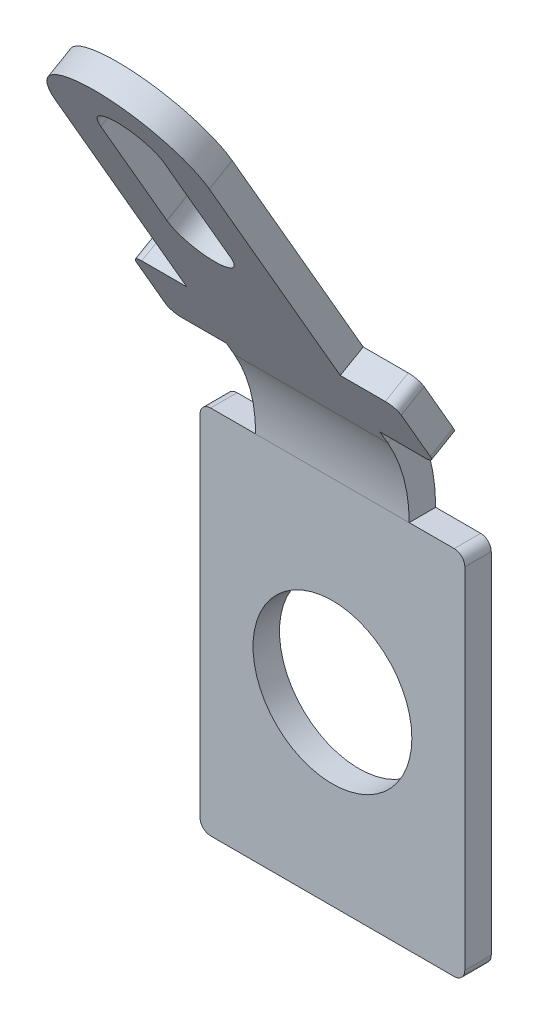
ISO-10303-21;
HEADER;
FILE_DESCRIPTION(('STEP AP214'),'2;1');
FILE_NAME('part.step','',(''),(''),'','','');
FILE_SCHEMA(('AUTOMOTIVE_DESIGN { 1 0 10303 214 1 1 1 1 }'));
ENDSEC;
DATA;
#1=APPLICATION_CONTEXT('core data for automotive mechanical design processes');
#2=APPLICATION_PROTOCOL_DEFINITION('international standard','automotive_design',2000,#1);
#3=PRODUCT_CONTEXT('',#1,'mechanical');
#4=PRODUCT('Part','Part','',(#3));
#5=PRODUCT_RELATED_PRODUCT_CATEGORY('part','',(#4));
#6=PRODUCT_DEFINITION_FORMATION('','',#4);
#7=PRODUCT_DEFINITION_CONTEXT('part definition',#1,'design');
#8=PRODUCT_DEFINITION('design','',#6,#7);
#9=PRODUCT_DEFINITION_SHAPE('','',#8);
#10=(LENGTH_UNIT() NAMED_UNIT(*) SI_UNIT(.MILLI.,.METRE.));
#11=(NAMED_UNIT(*) PLANE_ANGLE_UNIT() SI_UNIT($,.RADIAN.));
#12=(NAMED_UNIT(*) SI_UNIT($,.STERADIAN.) SOLID_ANGLE_UNIT());
#13=UNCERTAINTY_MEASURE_WITH_UNIT(LENGTH_MEASURE(1.E-05),#10,'distance_accuracy_value','');
#14=(GEOMETRIC_REPRESENTATION_CONTEXT(3) GLOBAL_UNCERTAINTY_ASSIGNED_CONTEXT((#13)) GLOBAL_UNIT_ASSIGNED_CONTEXT((#10,
#11,#12)) REPRESENTATION_CONTEXT('',''));
#15=CARTESIAN_POINT('',(0.,0.,0.));
#16=DIRECTION('',(0.,0.,1.));
#17=DIRECTION('',(1.,0.,0.));
#18=AXIS2_PLACEMENT_3D('',#15,#16,#17);
#19=CARTESIAN_POINT('',(-2.5,12.3480762113533,4.06698729810775));
#20=DIRECTION('',(1.,0.,0.));
#21=DIRECTION('',(0.,1.,0.));
#22=AXIS2_PLACEMENT_3D('',#19,#20,#21);
#23=PLANE('',#22);
#24=DIRECTION('',(0.,0.866025403784442,0.499999999999995));
#25=VECTOR('',#24,1.);
#26=CARTESIAN_POINT('',(-2.5,1.92884757729333,-1.94855715851496));
#27=LINE('',#26,#25);
#28=CARTESIAN_POINT('',(-2.5,5.68154390488543,0.218063076407229));
#29=VERTEX_POINT('',#28);
#30=CARTESIAN_POINT('',(-2.5,6.63417184904832,0.768063076407222));
#31=VERTEX_POINT('',#30);
#32=EDGE_CURVE('E389',#29,#31,#27,.T.);
#33=ORIENTED_EDGE('',*,*,#32,.F.);
#34=DIRECTION('',(0.,-0.500000000000001,0.866025403784438));
#35=VECTOR('',#34,1.);
#36=CARTESIAN_POINT('',(-2.5,5.68154390488546,0.218063076407183));
#37=LINE('',#36,#35);
#38=CARTESIAN_POINT('',(-2.5,5.43154390488543,0.651075778299447));
#39=VERTEX_POINT('',#38);
#40=EDGE_CURVE('E412',#29,#39,#37,.T.);
#41=ORIENTED_EDGE('',*,*,#40,.T.);
#42=DIRECTION('',(0.,-0.866025403784442,-0.499999999999995));
#43=VECTOR('',#42,1.);
#44=CARTESIAN_POINT('',(-2.5,12.0980762113533,4.49999999999997));
#45=LINE('',#44,#43);
#46=CARTESIAN_POINT('',(-2.5,6.38417184904832,1.20107577829944));
#47=VERTEX_POINT('',#46);
#48=EDGE_CURVE('E372',#39,#47,#45,.F.);
#49=ORIENTED_EDGE('',*,*,#48,.T.);
#50=DIRECTION('',(0.,-0.500000000000001,0.866025403784438));
#51=VECTOR('',#50,1.);
#52=CARTESIAN_POINT('',(-2.5,6.63417184904834,0.768063076407184));
#53=LINE('',#52,#51);
#54=EDGE_CURVE('E406',#47,#31,#53,.F.);
#55=ORIENTED_EDGE('',*,*,#54,.T.);
#56=EDGE_LOOP('',(#33,#41,#49,#55));
#57=FACE_BOUND('',#56,.T.);
#58=ADVANCED_FACE('F59',(#57),#23,.F.);
#59=CARTESIAN_POINT('',(2.5,4.55384757729334,-0.433012701892206));
#60=DIRECTION('',(-1.,0.,0.));
#61=DIRECTION('',(0.,0.,1.));
#62=AXIS2_PLACEMENT_3D('',#59,#60,#61);
#63=PLANE('',#62);
#64=DIRECTION('',(0.,-0.866025403784442,-0.499999999999995));
#65=VECTOR('',#64,1.);
#66=CARTESIAN_POINT('',(2.5,1.92884757729333,-1.94855715851496));
#67=LINE('',#66,#65);
#68=CARTESIAN_POINT('',(2.5,6.63417184904832,0.768063076407223));
#69=VERTEX_POINT('',#68);
#70=CARTESIAN_POINT('',(2.5,5.68154390488543,0.218063076407229));
#71=VERTEX_POINT('',#70);
#72=EDGE_CURVE('E386',#69,#71,#67,.T.);
#73=ORIENTED_EDGE('',*,*,#72,.F.);
#74=DIRECTION('',(0.,-0.500000000000001,0.866025403784438));
#75=VECTOR('',#74,1.);
#76=CARTESIAN_POINT('',(2.5,6.63417184904831,0.768063076407238));
#77=LINE('',#76,#75);
#78=CARTESIAN_POINT('',(2.5,6.38417184904832,1.20107577829944));
#79=VERTEX_POINT('',#78);
#80=EDGE_CURVE('E438',#69,#79,#77,.T.);
#81=ORIENTED_EDGE('',*,*,#80,.T.);
#82=DIRECTION('',(0.,0.866025403784442,0.499999999999995));
#83=VECTOR('',#82,1.);
#84=CARTESIAN_POINT('',(2.5,4.30384757729335,0.));
#85=LINE('',#84,#83);
#86=CARTESIAN_POINT('',(2.5,5.43154390488543,0.651075778299448));
#87=VERTEX_POINT('',#86);
#88=EDGE_CURVE('E392',#79,#87,#85,.F.);
#89=ORIENTED_EDGE('',*,*,#88,.T.);
#90=DIRECTION('',(0.,-0.500000000000001,0.866025403784438));
#91=VECTOR('',#90,1.);
#92=CARTESIAN_POINT('',(2.5,5.68154390488543,0.218063076407236));
#93=LINE('',#92,#91);
#94=EDGE_CURVE('E436',#87,#71,#93,.F.);
#95=ORIENTED_EDGE('',*,*,#94,.T.);
#96=EDGE_LOOP('',(#73,#81,#89,#95));
#97=FACE_BOUND('',#96,.T.);
#98=ADVANCED_FACE('F557',(#97),#63,.F.);
#99=CARTESIAN_POINT('',(0.,1.92884757729333,-1.94855715851496));
#100=DIRECTION('',(0.,-0.499999999999995,0.866025403784442));
#101=DIRECTION('',(0.,-0.866025403784442,-0.499999999999995));
#102=AXIS2_PLACEMENT_3D('',#99,#100,#101);
#103=PLANE('',#102);
#104=DIRECTION('',(0.,0.866025403784438,0.500000000000001));
#105=VECTOR('',#104,1.);
#106=CARTESIAN_POINT('',(0.6,11.0923393758659,3.34198729810775));
#107=LINE('',#106,#105);
#108=CARTESIAN_POINT('',(0.6,8.92727586640479,2.09198729810775));
#109=VERTEX_POINT('',#108);
#110=CARTESIAN_POINT('',(0.6,11.0923393758659,3.34198729810775));
#111=VERTEX_POINT('',#110);
#112=EDGE_CURVE('E304',#109,#111,#107,.T.);
#113=ORIENTED_EDGE('',*,*,#112,.T.);
#114=CARTESIAN_POINT('',(0.,11.0923393758659,3.34198729810775));
#115=DIRECTION('',(0.,-0.500000000000001,0.866025403784438));
#116=DIRECTION('',(1.,0.,0.));
#117=AXIS2_PLACEMENT_3D('',#114,#115,#116);
#118=CIRCLE('',#117,0.6);
#119=CARTESIAN_POINT('',(-0.6,11.0923393758659,3.34198729810775));
#120=VERTEX_POINT('',#119);
#121=EDGE_CURVE('E294',#111,#120,#118,.T.);
#122=ORIENTED_EDGE('',*,*,#121,.T.);
#123=DIRECTION('',(0.,-0.866025403784438,-0.500000000000001));
#124=VECTOR('',#123,1.);
#125=CARTESIAN_POINT('',(-0.6,11.0923393758659,3.34198729810775));
#126=LINE('',#125,#124);
#127=CARTESIAN_POINT('',(-0.6,8.92727586640478,2.09198729810777));
#128=VERTEX_POINT('',#127);
#129=EDGE_CURVE('E297',#120,#128,#126,.T.);
#130=ORIENTED_EDGE('',*,*,#129,.T.);
#131=CARTESIAN_POINT('',(0.,8.92727586640479,2.09198729810775));
#132=DIRECTION('',(0.,-0.500000000000001,0.866025403784438));
#133=DIRECTION('',(1.,0.,0.));
#134=AXIS2_PLACEMENT_3D('',#131,#132,#133);
#135=CIRCLE('',#134,0.6);
#136=EDGE_CURVE('E301',#128,#109,#135,.T.);
#137=ORIENTED_EDGE('',*,*,#136,.T.);
#138=EDGE_LOOP('',(#113,#122,#130,#137));
#139=FACE_BOUND('',#138,.T.);
#140=DIRECTION('',(-1.,0.,0.));
#141=VECTOR('',#140,1.);
#142=CARTESIAN_POINT('',(-1.45,5.50833882412857,0.118063076407182));
#143=LINE('',#142,#141);
#144=CARTESIAN_POINT('',(-1.45,5.50833882412857,0.118063076407182));
#145=VERTEX_POINT('',#144);
#146=CARTESIAN_POINT('',(-2.3,5.50833882412857,0.118063076407182));
#147=VERTEX_POINT('',#146);
#148=EDGE_CURVE('E328',#145,#147,#143,.T.);
#149=ORIENTED_EDGE('',*,*,#148,.T.);
#150=CARTESIAN_POINT('',(-2.3,5.68154390488543,0.218063076407229));
#151=DIRECTION('',(0.,-0.499999999999995,0.866025403784442));
#152=DIRECTION('',(0.,-0.866025403784442,-0.499999999999995));
#153=AXIS2_PLACEMENT_3D('',#150,#151,#152);
#154=CIRCLE('',#153,0.2);
#155=EDGE_CURVE('E431',#147,#29,#154,.F.);
#156=ORIENTED_EDGE('',*,*,#155,.T.);
#157=ORIENTED_EDGE('',*,*,#32,.T.);
#158=CARTESIAN_POINT('',(-2.3,6.63417184904832,0.768063076407223));
#159=DIRECTION('',(0.,-0.499999999999995,0.866025403784442));
#160=DIRECTION('',(0.,-0.866025403784442,-0.499999999999995));
#161=AXIS2_PLACEMENT_3D('',#158,#159,#160);
#162=CIRCLE('',#161,0.2);
#163=CARTESIAN_POINT('',(-2.3,6.80737692980523,0.868063076407183));
#164=VERTEX_POINT('',#163);
#165=EDGE_CURVE('E429',#31,#164,#162,.F.);
#166=ORIENTED_EDGE('',*,*,#165,.T.);
#167=DIRECTION('',(1.,0.,0.));
#168=VECTOR('',#167,1.);
#169=CARTESIAN_POINT('',(-2.5,6.80737692980523,0.868063076407183));
#170=LINE('',#169,#168);
#171=CARTESIAN_POINT('',(-1.45,6.80737692980523,0.868063076407183));
#172=VERTEX_POINT('',#171);
#173=EDGE_CURVE('E331',#164,#172,#170,.T.);
#174=ORIENTED_EDGE('',*,*,#173,.T.);
#175=DIRECTION('',(0.,0.866025403784438,0.500000000000001));
#176=VECTOR('',#175,1.);
#177=CARTESIAN_POINT('',(-1.45,6.80737692980523,0.868063076407183));
#178=LINE('',#177,#176);
#179=CARTESIAN_POINT('',(-1.45,11.0923393758659,3.34198729810775));
#180=VERTEX_POINT('',#179);
#181=EDGE_CURVE('E334',#172,#180,#178,.T.);
#182=ORIENTED_EDGE('',*,*,#181,.T.);
#183=CARTESIAN_POINT('',(0.,11.0923393758659,3.34198729810775));
#184=DIRECTION('',(0.,0.500000000000001,-0.866025403784438));
#185=DIRECTION('',(-1.,0.,0.));
#186=AXIS2_PLACEMENT_3D('',#183,#184,#185);
#187=CIRCLE('',#186,1.45);
#188=CARTESIAN_POINT('',(1.45,11.0923393758659,3.34198729810775));
#189=VERTEX_POINT('',#188);
#190=EDGE_CURVE('E337',#180,#189,#187,.T.);
#191=ORIENTED_EDGE('',*,*,#190,.T.);
#192=DIRECTION('',(0.,-0.866025403784438,-0.500000000000001));
#193=VECTOR('',#192,1.);
#194=CARTESIAN_POINT('',(1.45,11.0923393758659,3.34198729810775));
#195=LINE('',#194,#193);
#196=CARTESIAN_POINT('',(1.45,6.80737692980523,0.868063076407183));
#197=VERTEX_POINT('',#196);
#198=EDGE_CURVE('E340',#189,#197,#195,.T.);
#199=ORIENTED_EDGE('',*,*,#198,.T.);
#200=DIRECTION('',(1.,0.,0.));
#201=VECTOR('',#200,1.);
#202=CARTESIAN_POINT('',(1.45,6.80737692980523,0.868063076407183));
#203=LINE('',#202,#201);
#204=CARTESIAN_POINT('',(2.3,6.80737692980523,0.868063076407183));
#205=VERTEX_POINT('',#204);
#206=EDGE_CURVE('E343',#197,#205,#203,.T.);
#207=ORIENTED_EDGE('',*,*,#206,.T.);
#208=CARTESIAN_POINT('',(2.3,6.63417184904832,0.768063076407223));
#209=DIRECTION('',(0.,-0.499999999999995,0.866025403784442));
#210=DIRECTION('',(0.,-0.866025403784442,-0.499999999999995));
#211=AXIS2_PLACEMENT_3D('',#208,#209,#210);
#212=CIRCLE('',#211,0.2);
#213=EDGE_CURVE('E427',#205,#69,#212,.F.);
#214=ORIENTED_EDGE('',*,*,#213,.T.);
#215=ORIENTED_EDGE('',*,*,#72,.T.);
#216=CARTESIAN_POINT('',(2.3,5.68154390488543,0.218063076407229));
#217=DIRECTION('',(0.,-0.499999999999995,0.866025403784442));
#218=DIRECTION('',(0.,-0.866025403784442,-0.499999999999995));
#219=AXIS2_PLACEMENT_3D('',#216,#217,#218);
#220=CIRCLE('',#219,0.2);
#221=CARTESIAN_POINT('',(2.3,5.50833882412857,0.118063076407182));
#222=VERTEX_POINT('',#221);
#223=EDGE_CURVE('E425',#71,#222,#220,.F.);
#224=ORIENTED_EDGE('',*,*,#223,.T.);
#225=DIRECTION('',(-1.,0.,0.));
#226=VECTOR('',#225,1.);
#227=CARTESIAN_POINT('',(2.5,5.50833882412857,0.118063076407182));
#228=LINE('',#227,#226);
#229=CARTESIAN_POINT('',(1.45,5.50833882412857,0.118063076407182));
#230=VERTEX_POINT('',#229);
#231=EDGE_CURVE('E346',#222,#230,#228,.T.);
#232=ORIENTED_EDGE('',*,*,#231,.T.);
#233=DIRECTION('',(0.,-0.866025403784438,-0.500000000000001));
#234=VECTOR('',#233,1.);
#235=CARTESIAN_POINT('',(1.45,5.50833882412857,0.118063076407182));
#236=LINE('',#235,#234);
#237=CARTESIAN_POINT('',(1.45,5.24999999999998,-0.0310889132455919));
#238=VERTEX_POINT('',#237);
#239=EDGE_CURVE('E348',#230,#238,#236,.T.);
#240=ORIENTED_EDGE('',*,*,#239,.T.);
#241=DIRECTION('',(1.,0.,0.));
#242=VECTOR('',#241,1.);
#243=CARTESIAN_POINT('',(2.5,5.24999999999997,-0.0310889132455307));
#244=LINE('',#243,#242);
#245=CARTESIAN_POINT('',(-1.45,5.24999999999996,-0.0310889132455606));
#246=VERTEX_POINT('',#245);
#247=EDGE_CURVE('E281',#246,#238,#244,.T.);
#248=ORIENTED_EDGE('',*,*,#247,.F.);
#249=DIRECTION('',(0.,0.866025403784438,0.500000000000001));
#250=VECTOR('',#249,1.);
#251=CARTESIAN_POINT('',(-1.45,3.7762880165597,-0.88193692359282));
#252=LINE('',#251,#250);
#253=EDGE_CURVE('E332',#246,#145,#252,.T.);
#254=ORIENTED_EDGE('',*,*,#253,.T.);
#255=EDGE_LOOP('',(#149,#156,#157,#166,#174,#182,#191,#199,#207,#214,#215,#224,#232,#240,#248,#254));
#256=FACE_BOUND('',#255,.T.);
#257=ADVANCED_FACE('F562',(#139,#256),#103,.F.);
#258=CARTESIAN_POINT('',(0.,1.67884757729333,-1.51554445662274));
#259=DIRECTION('',(0.,-0.499999999999995,0.866025403784442));
#260=DIRECTION('',(0.,-0.866025403784442,-0.499999999999995));
#261=AXIS2_PLACEMENT_3D('',#258,#259,#260);
#262=PLANE('',#261);
#263=CARTESIAN_POINT('',(0.,10.8423393758659,3.77500000000002));
#264=DIRECTION('',(0.,-0.500000000000001,0.866025403784438));
#265=DIRECTION('',(1.,0.,0.));
#266=AXIS2_PLACEMENT_3D('',#263,#264,#265);
#267=CIRCLE('',#266,0.6);
#268=CARTESIAN_POINT('',(0.6,10.8423393758659,3.77500000000002));
#269=VERTEX_POINT('',#268);
#270=CARTESIAN_POINT('',(-0.6,10.8423393758659,3.77499999999998));
#271=VERTEX_POINT('',#270);
#272=EDGE_CURVE('E308',#269,#271,#267,.T.);
#273=ORIENTED_EDGE('',*,*,#272,.F.);
#274=DIRECTION('',(0.,0.866025403784438,0.500000000000001));
#275=VECTOR('',#274,1.);
#276=CARTESIAN_POINT('',(0.6,10.8423393758659,3.77500000000002));
#277=LINE('',#276,#275);
#278=CARTESIAN_POINT('',(0.6,8.67727586640476,2.52500000000002));
#279=VERTEX_POINT('',#278);
#280=EDGE_CURVE('E298',#279,#269,#277,.T.);
#281=ORIENTED_EDGE('',*,*,#280,.F.);
#282=CARTESIAN_POINT('',(0.,8.67727586640476,2.52500000000002));
#283=DIRECTION('',(0.,-0.500000000000001,0.866025403784438));
#284=DIRECTION('',(1.,0.,0.));
#285=AXIS2_PLACEMENT_3D('',#282,#283,#284);
#286=CIRCLE('',#285,0.6);
#287=CARTESIAN_POINT('',(-0.6,8.67727586640476,2.52500000000002));
#288=VERTEX_POINT('',#287);
#289=EDGE_CURVE('E314',#288,#279,#286,.T.);
#290=ORIENTED_EDGE('',*,*,#289,.F.);
#291=DIRECTION('',(0.,-0.866025403784438,-0.500000000000001));
#292=VECTOR('',#291,1.);
#293=CARTESIAN_POINT('',(-0.6,10.8423393758659,3.77500000000002));
#294=LINE('',#293,#292);
#295=EDGE_CURVE('E310',#271,#288,#294,.T.);
#296=ORIENTED_EDGE('',*,*,#295,.F.);
#297=EDGE_LOOP('',(#273,#281,#290,#296));
#298=FACE_BOUND('',#297,.T.);
#299=ORIENTED_EDGE('',*,*,#48,.F.);
#300=CARTESIAN_POINT('',(-2.3,5.43154390488543,0.651075778299447));
#301=DIRECTION('',(0.,-0.499999999999995,0.866025403784442));
#302=DIRECTION('',(0.,-0.866025403784442,-0.499999999999995));
#303=AXIS2_PLACEMENT_3D('',#300,#301,#302);
#304=CIRCLE('',#303,0.2);
#305=CARTESIAN_POINT('',(-2.3,5.25833882412854,0.551075778299451));
#306=VERTEX_POINT('',#305);
#307=EDGE_CURVE('E421',#39,#306,#304,.T.);
#308=ORIENTED_EDGE('',*,*,#307,.T.);
#309=DIRECTION('',(-1.,0.,0.));
#310=VECTOR('',#309,1.);
#311=CARTESIAN_POINT('',(-1.45,5.25833882412854,0.551075778299451));
#312=LINE('',#311,#310);
#313=CARTESIAN_POINT('',(-1.45,5.25833882412854,0.551075778299451));
#314=VERTEX_POINT('',#313);
#315=EDGE_CURVE('E349',#314,#306,#312,.T.);
#316=ORIENTED_EDGE('',*,*,#315,.F.);
#317=DIRECTION('',(0.,0.866025403784438,0.500000000000001));
#318=VECTOR('',#317,1.);
#319=CARTESIAN_POINT('',(-1.45,3.52628801655967,-0.44892422170055));
#320=LINE('',#319,#318);
#321=CARTESIAN_POINT('',(-1.45,4.99999999999995,0.401923788646678));
#322=VERTEX_POINT('',#321);
#323=EDGE_CURVE('E321',#322,#314,#320,.T.);
#324=ORIENTED_EDGE('',*,*,#323,.F.);
#325=DIRECTION('',(-1.,0.,0.));
#326=VECTOR('',#325,1.);
#327=CARTESIAN_POINT('',(2.5,4.99999999999997,0.401923788646689));
#328=LINE('',#327,#326);
#329=CARTESIAN_POINT('',(1.45,4.99999999999997,0.401923788646689));
#330=VERTEX_POINT('',#329);
#331=EDGE_CURVE('E400',#330,#322,#328,.T.);
#332=ORIENTED_EDGE('',*,*,#331,.F.);
#333=DIRECTION('',(0.,-0.866025403784438,-0.500000000000001));
#334=VECTOR('',#333,1.);
#335=CARTESIAN_POINT('',(1.45,5.25833882412854,0.551075778299452));
#336=LINE('',#335,#334);
#337=CARTESIAN_POINT('',(1.45,5.25833882412854,0.551075778299452));
#338=VERTEX_POINT('',#337);
#339=EDGE_CURVE('E367',#338,#330,#336,.T.);
#340=ORIENTED_EDGE('',*,*,#339,.F.);
#341=DIRECTION('',(-1.,0.,0.));
#342=VECTOR('',#341,1.);
#343=CARTESIAN_POINT('',(2.5,5.25833882412854,0.551075778299452));
#344=LINE('',#343,#342);
#345=CARTESIAN_POINT('',(2.3,5.25833882412854,0.551075778299452));
#346=VERTEX_POINT('',#345);
#347=EDGE_CURVE('E365',#346,#338,#344,.T.);
#348=ORIENTED_EDGE('',*,*,#347,.F.);
#349=CARTESIAN_POINT('',(2.3,5.43154390488543,0.651075778299447));
#350=DIRECTION('',(0.,-0.499999999999995,0.866025403784442));
#351=DIRECTION('',(0.,-0.866025403784442,-0.499999999999995));
#352=AXIS2_PLACEMENT_3D('',#349,#350,#351);
#353=CIRCLE('',#352,0.2);
#354=EDGE_CURVE('E415',#346,#87,#353,.T.);
#355=ORIENTED_EDGE('',*,*,#354,.T.);
#356=ORIENTED_EDGE('',*,*,#88,.F.);
#357=CARTESIAN_POINT('',(2.3,6.38417184904832,1.20107577829944));
#358=DIRECTION('',(0.,-0.499999999999995,0.866025403784442));
#359=DIRECTION('',(0.,-0.866025403784442,-0.499999999999995));
#360=AXIS2_PLACEMENT_3D('',#357,#358,#359);
#361=CIRCLE('',#360,0.2);
#362=CARTESIAN_POINT('',(2.3,6.5573769298052,1.30107577829945));
#363=VERTEX_POINT('',#362);
#364=EDGE_CURVE('E417',#79,#363,#361,.T.);
#365=ORIENTED_EDGE('',*,*,#364,.T.);
#366=DIRECTION('',(1.,0.,0.));
#367=VECTOR('',#366,1.);
#368=CARTESIAN_POINT('',(1.45,6.5573769298052,1.30107577829945));
#369=LINE('',#368,#367);
#370=CARTESIAN_POINT('',(1.45,6.5573769298052,1.30107577829945));
#371=VERTEX_POINT('',#370);
#372=EDGE_CURVE('E362',#371,#363,#369,.T.);
#373=ORIENTED_EDGE('',*,*,#372,.F.);
#374=DIRECTION('',(0.,-0.866025403784438,-0.500000000000001));
#375=VECTOR('',#374,1.);
#376=CARTESIAN_POINT('',(1.45,10.8423393758659,3.77500000000002));
#377=LINE('',#376,#375);
#378=CARTESIAN_POINT('',(1.45,10.8423393758659,3.77500000000002));
#379=VERTEX_POINT('',#378);
#380=EDGE_CURVE('E359',#379,#371,#377,.T.);
#381=ORIENTED_EDGE('',*,*,#380,.F.);
#382=CARTESIAN_POINT('',(0.,10.8423393758659,3.77500000000002));
#383=DIRECTION('',(0.,0.500000000000001,-0.866025403784438));
#384=DIRECTION('',(-1.,0.,0.));
#385=AXIS2_PLACEMENT_3D('',#382,#383,#384);
#386=CIRCLE('',#385,1.45);
#387=CARTESIAN_POINT('',(-1.45,10.8423393758659,3.77500000000002));
#388=VERTEX_POINT('',#387);
#389=EDGE_CURVE('E357',#388,#379,#386,.T.);
#390=ORIENTED_EDGE('',*,*,#389,.F.);
#391=DIRECTION('',(0.,0.866025403784438,0.500000000000001));
#392=VECTOR('',#391,1.);
#393=CARTESIAN_POINT('',(-1.45,6.5573769298052,1.30107577829945));
#394=LINE('',#393,#392);
#395=CARTESIAN_POINT('',(-1.45,6.5573769298052,1.30107577829945));
#396=VERTEX_POINT('',#395);
#397=EDGE_CURVE('E354',#396,#388,#394,.T.);
#398=ORIENTED_EDGE('',*,*,#397,.F.);
#399=DIRECTION('',(1.,0.,0.));
#400=VECTOR('',#399,1.);
#401=CARTESIAN_POINT('',(-2.5,6.5573769298052,1.30107577829945));
#402=LINE('',#401,#400);
#403=CARTESIAN_POINT('',(-2.3,6.5573769298052,1.30107577829945));
#404=VERTEX_POINT('',#403);
#405=EDGE_CURVE('E352',#404,#396,#402,.T.);
#406=ORIENTED_EDGE('',*,*,#405,.F.);
#407=CARTESIAN_POINT('',(-2.3,6.38417184904832,1.20107577829944));
#408=DIRECTION('',(0.,-0.499999999999995,0.866025403784442));
#409=DIRECTION('',(0.,-0.866025403784442,-0.499999999999995));
#410=AXIS2_PLACEMENT_3D('',#407,#408,#409);
#411=CIRCLE('',#410,0.2);
#412=EDGE_CURVE('E419',#404,#47,#411,.T.);
#413=ORIENTED_EDGE('',*,*,#412,.T.);
#414=EDGE_LOOP('',(#299,#308,#316,#324,#332,#340,#348,#355,#356,#365,#373,#381,#390,#398,#406,#413));
#415=FACE_BOUND('',#414,.T.);
#416=ADVANCED_FACE('F540',(#298,#415),#262,.T.);
#417=CARTESIAN_POINT('',(-1.45,3.7762880165597,-0.88193692359282));
#418=DIRECTION('',(1.,0.,0.));
#419=DIRECTION('',(0.,0.866025403784438,0.500000000000001));
#420=AXIS2_PLACEMENT_3D('',#417,#418,#419);
#421=PLANE('',#420);
#422=DIRECTION('',(0.,0.500000000000001,-0.866025403784438));
#423=VECTOR('',#422,1.);
#424=CARTESIAN_POINT('',(-1.45,4.99999999999995,0.401923788646678));
#425=LINE('',#424,#423);
#426=EDGE_CURVE('E403',#322,#246,#425,.T.);
#427=ORIENTED_EDGE('',*,*,#426,.F.);
#428=ORIENTED_EDGE('',*,*,#323,.T.);
#429=DIRECTION('',(0.,-0.500000000000001,0.866025403784438));
#430=VECTOR('',#429,1.);
#431=CARTESIAN_POINT('',(-1.45,5.50833882412857,0.118063076407182));
#432=LINE('',#431,#430);
#433=EDGE_CURVE('E383',#145,#314,#432,.T.);
#434=ORIENTED_EDGE('',*,*,#433,.F.);
#435=ORIENTED_EDGE('',*,*,#253,.F.);
#436=EDGE_LOOP('',(#427,#428,#434,#435));
#437=FACE_BOUND('',#436,.T.);
#438=ADVANCED_FACE('F605',(#437),#421,.F.);
#439=CARTESIAN_POINT('',(-1.45,5.50833882412857,0.118063076407182));
#440=DIRECTION('',(0.,0.866025403784438,0.500000000000001));
#441=DIRECTION('',(0.,-0.500000000000001,0.866025403784438));
#442=AXIS2_PLACEMENT_3D('',#439,#440,#441);
#443=PLANE('',#442);
#444=ORIENTED_EDGE('',*,*,#315,.T.);
#445=DIRECTION('',(0.,-0.500000000000001,0.866025403784438));
#446=VECTOR('',#445,1.);
#447=CARTESIAN_POINT('',(-2.3,5.50833882412857,0.118063076407182));
#448=LINE('',#447,#446);
#449=EDGE_CURVE('E423',#306,#147,#448,.F.);
#450=ORIENTED_EDGE('',*,*,#449,.T.);
#451=ORIENTED_EDGE('',*,*,#148,.F.);
#452=ORIENTED_EDGE('',*,*,#433,.T.);
#453=EDGE_LOOP('',(#444,#450,#451,#452));
#454=FACE_BOUND('',#453,.T.);
#455=ADVANCED_FACE('F601',(#454),#443,.F.);
#456=CARTESIAN_POINT('',(1.45,5.50833882412857,0.118063076407182));
#457=DIRECTION('',(-1.,0.,0.));
#458=DIRECTION('',(0.,-0.866025403784438,-0.500000000000001));
#459=AXIS2_PLACEMENT_3D('',#456,#457,#458);
#460=PLANE('',#459);
#461=DIRECTION('',(0.,-0.499999999999956,0.866025403784464));
#462=VECTOR('',#461,1.);
#463=CARTESIAN_POINT('',(1.45,5.24999999999998,-0.0310889132455919));
#464=LINE('',#463,#462);
#465=EDGE_CURVE('E398',#238,#330,#464,.T.);
#466=ORIENTED_EDGE('',*,*,#465,.F.);
#467=ORIENTED_EDGE('',*,*,#239,.F.);
#468=DIRECTION('',(0.,-0.500000000000001,0.866025403784438));
#469=VECTOR('',#468,1.);
#470=CARTESIAN_POINT('',(1.45,5.50833882412857,0.118063076407182));
#471=LINE('',#470,#469);
#472=EDGE_CURVE('E369',#230,#338,#471,.T.);
#473=ORIENTED_EDGE('',*,*,#472,.T.);
#474=ORIENTED_EDGE('',*,*,#339,.T.);
#475=EDGE_LOOP('',(#466,#467,#473,#474));
#476=FACE_BOUND('',#475,.T.);
#477=ADVANCED_FACE('F546',(#476),#460,.F.);
#478=CARTESIAN_POINT('',(2.5,5.50833882412857,0.118063076407182));
#479=DIRECTION('',(0.,0.866025403784438,0.500000000000001));
#480=DIRECTION('',(0.,-0.500000000000001,0.866025403784438));
#481=AXIS2_PLACEMENT_3D('',#478,#479,#480);
#482=PLANE('',#481);
#483=ORIENTED_EDGE('',*,*,#231,.F.);
#484=DIRECTION('',(0.,-0.500000000000001,0.866025403784438));
#485=VECTOR('',#484,1.);
#486=CARTESIAN_POINT('',(2.3,5.50833882412857,0.118063076407182));
#487=LINE('',#486,#485);
#488=EDGE_CURVE('E443',#222,#346,#487,.T.);
#489=ORIENTED_EDGE('',*,*,#488,.T.);
#490=ORIENTED_EDGE('',*,*,#347,.T.);
#491=ORIENTED_EDGE('',*,*,#472,.F.);
#492=EDGE_LOOP('',(#483,#489,#490,#491));
#493=FACE_BOUND('',#492,.T.);
#494=ADVANCED_FACE('F550',(#493),#482,.F.);
#495=CARTESIAN_POINT('',(0.,11.0923393758659,3.34198729810775));
#496=DIRECTION('',(0.,-0.500000000000001,0.866025403784438));
#497=DIRECTION('',(1.,0.,0.));
#498=AXIS2_PLACEMENT_3D('',#495,#496,#497);
#499=CYLINDRICAL_SURFACE('',#498,1.45);
#500=ORIENTED_EDGE('',*,*,#389,.T.);
#501=DIRECTION('',(0.,-0.500000000000001,0.866025403784438));
#502=VECTOR('',#501,1.);
#503=CARTESIAN_POINT('',(1.45,11.0923393758659,3.34198729810775));
#504=LINE('',#503,#502);
#505=EDGE_CURVE('E375',#189,#379,#504,.T.);
#506=ORIENTED_EDGE('',*,*,#505,.F.);
#507=ORIENTED_EDGE('',*,*,#190,.F.);
#508=DIRECTION('',(0.,-0.500000000000001,0.866025403784438));
#509=VECTOR('',#508,1.);
#510=CARTESIAN_POINT('',(-1.45,11.0923393758659,3.34198729810775));
#511=LINE('',#510,#509);
#512=EDGE_CURVE('E378',#180,#388,#511,.T.);
#513=ORIENTED_EDGE('',*,*,#512,.T.);
#514=EDGE_LOOP('',(#500,#506,#507,#513));
#515=FACE_BOUND('',#514,.T.);
#516=ADVANCED_FACE('F579',(#515),#499,.T.);
#517=CARTESIAN_POINT('',(1.45,6.80737692980523,0.868063076407183));
#518=DIRECTION('',(0.,-0.866025403784438,-0.500000000000001));
#519=DIRECTION('',(0.,0.500000000000001,-0.866025403784438));
#520=AXIS2_PLACEMENT_3D('',#517,#518,#519);
#521=PLANE('',#520);
#522=ORIENTED_EDGE('',*,*,#372,.T.);
#523=DIRECTION('',(0.,-0.500000000000001,0.866025403784438));
#524=VECTOR('',#523,1.);
#525=CARTESIAN_POINT('',(2.3,6.80737692980523,0.868063076407183));
#526=LINE('',#525,#524);
#527=EDGE_CURVE('E441',#363,#205,#526,.F.);
#528=ORIENTED_EDGE('',*,*,#527,.T.);
#529=ORIENTED_EDGE('',*,*,#206,.F.);
#530=DIRECTION('',(0.,-0.500000000000001,0.866025403784438));
#531=VECTOR('',#530,1.);
#532=CARTESIAN_POINT('',(1.45,6.80737692980523,0.868063076407183));
#533=LINE('',#532,#531);
#534=EDGE_CURVE('E373',#197,#371,#533,.T.);
#535=ORIENTED_EDGE('',*,*,#534,.T.);
#536=EDGE_LOOP('',(#522,#528,#529,#535));
#537=FACE_BOUND('',#536,.T.);
#538=ADVANCED_FACE('F570',(#537),#521,.F.);
#539=CARTESIAN_POINT('',(1.45,11.0923393758659,3.34198729810775));
#540=DIRECTION('',(-1.,0.,0.));
#541=DIRECTION('',(0.,-0.866025403784438,-0.500000000000001));
#542=AXIS2_PLACEMENT_3D('',#539,#540,#541);
#543=PLANE('',#542);
#544=ORIENTED_EDGE('',*,*,#380,.T.);
#545=ORIENTED_EDGE('',*,*,#534,.F.);
#546=ORIENTED_EDGE('',*,*,#198,.F.);
#547=ORIENTED_EDGE('',*,*,#505,.T.);
#548=EDGE_LOOP('',(#544,#545,#546,#547));
#549=FACE_BOUND('',#548,.T.);
#550=ADVANCED_FACE('F574',(#549),#543,.F.);
#551=CARTESIAN_POINT('',(-1.45,6.80737692980523,0.868063076407183));
#552=DIRECTION('',(1.,0.,0.));
#553=DIRECTION('',(0.,0.866025403784438,0.500000000000001));
#554=AXIS2_PLACEMENT_3D('',#551,#552,#553);
#555=PLANE('',#554);
#556=ORIENTED_EDGE('',*,*,#397,.T.);
#557=ORIENTED_EDGE('',*,*,#512,.F.);
#558=ORIENTED_EDGE('',*,*,#181,.F.);
#559=DIRECTION('',(0.,-0.500000000000001,0.866025403784438));
#560=VECTOR('',#559,1.);
#561=CARTESIAN_POINT('',(-1.45,6.80737692980523,0.868063076407183));
#562=LINE('',#561,#560);
#563=EDGE_CURVE('E380',#172,#396,#562,.T.);
#564=ORIENTED_EDGE('',*,*,#563,.T.);
#565=EDGE_LOOP('',(#556,#557,#558,#564));
#566=FACE_BOUND('',#565,.T.);
#567=ADVANCED_FACE('F583',(#566),#555,.F.);
#568=CARTESIAN_POINT('',(-2.5,6.80737692980523,0.868063076407183));
#569=DIRECTION('',(0.,-0.866025403784438,-0.500000000000001));
#570=DIRECTION('',(0.,0.500000000000001,-0.866025403784438));
#571=AXIS2_PLACEMENT_3D('',#568,#569,#570);
#572=PLANE('',#571);
#573=ORIENTED_EDGE('',*,*,#173,.F.);
#574=DIRECTION('',(0.,-0.500000000000001,0.866025403784438));
#575=VECTOR('',#574,1.);
#576=CARTESIAN_POINT('',(-2.3,6.80737692980523,0.868063076407183));
#577=LINE('',#576,#575);
#578=EDGE_CURVE('E433',#164,#404,#577,.T.);
#579=ORIENTED_EDGE('',*,*,#578,.T.);
#580=ORIENTED_EDGE('',*,*,#405,.T.);
#581=ORIENTED_EDGE('',*,*,#563,.F.);
#582=EDGE_LOOP('',(#573,#579,#580,#581));
#583=FACE_BOUND('',#582,.T.);
#584=ADVANCED_FACE('F587',(#583),#572,.F.);
#585=CARTESIAN_POINT('',(0.,11.0923393758659,3.34198729810775));
#586=DIRECTION('',(0.,-0.500000000000001,0.866025403784438));
#587=DIRECTION('',(1.,0.,0.));
#588=AXIS2_PLACEMENT_3D('',#585,#586,#587);
#589=CYLINDRICAL_SURFACE('',#588,0.6);
#590=ORIENTED_EDGE('',*,*,#272,.T.);
#591=DIRECTION('',(0.,-0.500000000000001,0.866025403784438));
#592=VECTOR('',#591,1.);
#593=CARTESIAN_POINT('',(-0.6,11.0923393758659,3.34198729810775));
#594=LINE('',#593,#592);
#595=EDGE_CURVE('E307',#120,#271,#594,.T.);
#596=ORIENTED_EDGE('',*,*,#595,.F.);
#597=ORIENTED_EDGE('',*,*,#121,.F.);
#598=DIRECTION('',(0.,-0.500000000000001,0.866025403784438));
#599=VECTOR('',#598,1.);
#600=CARTESIAN_POINT('',(0.6,11.0923393758659,3.34198729810775));
#601=LINE('',#600,#599);
#602=EDGE_CURVE('E319',#111,#269,#601,.T.);
#603=ORIENTED_EDGE('',*,*,#602,.T.);
#604=EDGE_LOOP('',(#590,#596,#597,#603));
#605=FACE_BOUND('',#604,.T.);
#606=ADVANCED_FACE('F634',(#605),#589,.F.);
#607=CARTESIAN_POINT('',(0.6,11.0923393758659,3.34198729810775));
#608=DIRECTION('',(1.,0.,0.));
#609=DIRECTION('',(0.,0.500000000000001,-0.866025403784438));
#610=AXIS2_PLACEMENT_3D('',#607,#608,#609);
#611=PLANE('',#610);
#612=ORIENTED_EDGE('',*,*,#280,.T.);
#613=ORIENTED_EDGE('',*,*,#602,.F.);
#614=ORIENTED_EDGE('',*,*,#112,.F.);
#615=DIRECTION('',(0.,-0.500000000000001,0.866025403784438));
#616=VECTOR('',#615,1.);
#617=CARTESIAN_POINT('',(0.6,8.92727586640479,2.09198729810775));
#618=LINE('',#617,#616);
#619=EDGE_CURVE('E322',#109,#279,#618,.T.);
#620=ORIENTED_EDGE('',*,*,#619,.T.);
#621=EDGE_LOOP('',(#612,#613,#614,#620));
#622=FACE_BOUND('',#621,.T.);
#623=ADVANCED_FACE('F651',(#622),#611,.F.);
#624=CARTESIAN_POINT('',(0.,8.92727586640479,2.09198729810775));
#625=DIRECTION('',(0.,-0.500000000000001,0.866025403784438));
#626=DIRECTION('',(1.,0.,0.));
#627=AXIS2_PLACEMENT_3D('',#624,#625,#626);
#628=CYLINDRICAL_SURFACE('',#627,0.6);
#629=ORIENTED_EDGE('',*,*,#289,.T.);
#630=ORIENTED_EDGE('',*,*,#619,.F.);
#631=ORIENTED_EDGE('',*,*,#136,.F.);
#632=DIRECTION('',(0.,-0.500000000000001,0.866025403784438));
#633=VECTOR('',#632,1.);
#634=CARTESIAN_POINT('',(-0.6,8.92727586640479,2.09198729810775));
#635=LINE('',#634,#633);
#636=EDGE_CURVE('E324',#128,#288,#635,.T.);
#637=ORIENTED_EDGE('',*,*,#636,.T.);
#638=EDGE_LOOP('',(#629,#630,#631,#637));
#639=FACE_BOUND('',#638,.T.);
#640=ADVANCED_FACE('F662',(#639),#628,.F.);
#641=CARTESIAN_POINT('',(-0.6,11.0923393758659,3.34198729810775));
#642=DIRECTION('',(-1.,0.,0.));
#643=DIRECTION('',(0.,-0.500000000000001,0.866025403784438));
#644=AXIS2_PLACEMENT_3D('',#641,#642,#643);
#645=PLANE('',#644);
#646=ORIENTED_EDGE('',*,*,#295,.T.);
#647=ORIENTED_EDGE('',*,*,#636,.F.);
#648=ORIENTED_EDGE('',*,*,#129,.F.);
#649=ORIENTED_EDGE('',*,*,#595,.T.);
#650=EDGE_LOOP('',(#646,#647,#648,#649));
#651=FACE_BOUND('',#650,.T.);
#652=ADVANCED_FACE('F659',(#651),#645,.F.);
#653=CARTESIAN_POINT('',(-2.5,-3.5,-0.5));
#654=DIRECTION('',(-1.,0.,0.));
#655=DIRECTION('',(0.,0.,1.));
#656=AXIS2_PLACEMENT_3D('',#653,#654,#655);
#657=PLANE('',#656);
#658=DIRECTION('',(0.,-1.,0.));
#659=VECTOR('',#658,1.);
#660=CARTESIAN_POINT('',(-2.5,-3.5,-0.5));
#661=LINE('',#660,#659);
#662=CARTESIAN_POINT('',(-2.5,3.3,-0.5));
#663=VERTEX_POINT('',#662);
#664=CARTESIAN_POINT('',(-2.5,-3.3,-0.5));
#665=VERTEX_POINT('',#664);
#666=EDGE_CURVE('E289',#663,#665,#661,.T.);
#667=ORIENTED_EDGE('',*,*,#666,.T.);
#668=DIRECTION('',(0.,0.,1.));
#669=VECTOR('',#668,1.);
#670=CARTESIAN_POINT('',(-2.5,-3.3,-0.5));
#671=LINE('',#670,#669);
#672=CARTESIAN_POINT('',(-2.5,-3.3,0.));
#673=VERTEX_POINT('',#672);
#674=EDGE_CURVE('E473',#665,#673,#671,.T.);
#675=ORIENTED_EDGE('',*,*,#674,.T.);
#676=DIRECTION('',(0.,-1.,0.));
#677=VECTOR('',#676,1.);
#678=CARTESIAN_POINT('',(-2.5,-3.5,0.));
#679=LINE('',#678,#677);
#680=CARTESIAN_POINT('',(-2.5,3.3,0.));
#681=VERTEX_POINT('',#680);
#682=EDGE_CURVE('E491',#681,#673,#679,.T.);
#683=ORIENTED_EDGE('',*,*,#682,.F.);
#684=DIRECTION('',(0.,0.,1.));
#685=VECTOR('',#684,1.);
#686=CARTESIAN_POINT('',(-2.5,3.3,-0.500000000000059));
#687=LINE('',#686,#685);
#688=EDGE_CURVE('E471',#681,#663,#687,.F.);
#689=ORIENTED_EDGE('',*,*,#688,.T.);
#690=EDGE_LOOP('',(#667,#675,#683,#689));
#691=FACE_BOUND('',#690,.T.);
#692=ADVANCED_FACE('F515',(#691),#657,.T.);
#693=CARTESIAN_POINT('',(-2.5,-3.5,-0.5));
#694=DIRECTION('',(0.,-1.,0.));
#695=DIRECTION('',(0.,0.,-1.));
#696=AXIS2_PLACEMENT_3D('',#693,#694,#695);
#697=PLANE('',#696);
#698=DIRECTION('',(1.,0.,0.));
#699=VECTOR('',#698,1.);
#700=CARTESIAN_POINT('',(-2.5,-3.5,-0.5));
#701=LINE('',#700,#699);
#702=CARTESIAN_POINT('',(-2.3,-3.5,-0.5));
#703=VERTEX_POINT('',#702);
#704=CARTESIAN_POINT('',(2.3,-3.5,-0.5));
#705=VERTEX_POINT('',#704);
#706=EDGE_CURVE('E510',#703,#705,#701,.T.);
#707=ORIENTED_EDGE('',*,*,#706,.T.);
#708=DIRECTION('',(0.,0.,1.));
#709=VECTOR('',#708,1.);
#710=CARTESIAN_POINT('',(2.3,-3.5,-0.5));
#711=LINE('',#710,#709);
#712=CARTESIAN_POINT('',(2.3,-3.5,0.));
#713=VERTEX_POINT('',#712);
#714=EDGE_CURVE('E448',#705,#713,#711,.T.);
#715=ORIENTED_EDGE('',*,*,#714,.T.);
#716=DIRECTION('',(1.,0.,0.));
#717=VECTOR('',#716,1.);
#718=CARTESIAN_POINT('',(-2.5,-3.5,0.));
#719=LINE('',#718,#717);
#720=CARTESIAN_POINT('',(-2.3,-3.5,0.));
#721=VERTEX_POINT('',#720);
#722=EDGE_CURVE('E311',#721,#713,#719,.T.);
#723=ORIENTED_EDGE('',*,*,#722,.F.);
#724=DIRECTION('',(0.,0.,1.));
#725=VECTOR('',#724,1.);
#726=CARTESIAN_POINT('',(-2.3,-3.5,-0.5));
#727=LINE('',#726,#725);
#728=EDGE_CURVE('E446',#721,#703,#727,.F.);
#729=ORIENTED_EDGE('',*,*,#728,.T.);
#730=EDGE_LOOP('',(#707,#715,#723,#729));
#731=FACE_BOUND('',#730,.T.);
#732=ADVANCED_FACE('F523',(#731),#697,.T.);
#733=CARTESIAN_POINT('',(2.5,-3.5,-0.5));
#734=DIRECTION('',(1.,0.,0.));
#735=DIRECTION('',(0.,0.,-1.));
#736=AXIS2_PLACEMENT_3D('',#733,#734,#735);
#737=PLANE('',#736);
#738=DIRECTION('',(0.,1.,0.));
#739=VECTOR('',#738,1.);
#740=CARTESIAN_POINT('',(2.5,-3.5,0.));
#741=LINE('',#740,#739);
#742=CARTESIAN_POINT('',(2.5,-3.3,0.));
#743=VERTEX_POINT('',#742);
#744=CARTESIAN_POINT('',(2.5,3.3,0.));
#745=VERTEX_POINT('',#744);
#746=EDGE_CURVE('E273',#743,#745,#741,.T.);
#747=ORIENTED_EDGE('',*,*,#746,.F.);
#748=DIRECTION('',(0.,0.,1.));
#749=VECTOR('',#748,1.);
#750=CARTESIAN_POINT('',(2.5,-3.3,-0.5));
#751=LINE('',#750,#749);
#752=CARTESIAN_POINT('',(2.5,-3.3,-0.5));
#753=VERTEX_POINT('',#752);
#754=EDGE_CURVE('E462',#743,#753,#751,.F.);
#755=ORIENTED_EDGE('',*,*,#754,.T.);
#756=DIRECTION('',(0.,1.,0.));
#757=VECTOR('',#756,1.);
#758=CARTESIAN_POINT('',(2.5,-3.5,-0.5));
#759=LINE('',#758,#757);
#760=CARTESIAN_POINT('',(2.5,3.3,-0.5));
#761=VERTEX_POINT('',#760);
#762=EDGE_CURVE('E507',#753,#761,#759,.T.);
#763=ORIENTED_EDGE('',*,*,#762,.T.);
#764=DIRECTION('',(0.,0.,1.));
#765=VECTOR('',#764,1.);
#766=CARTESIAN_POINT('',(2.5,3.3,0.));
#767=LINE('',#766,#765);
#768=EDGE_CURVE('E459',#761,#745,#767,.T.);
#769=ORIENTED_EDGE('',*,*,#768,.T.);
#770=EDGE_LOOP('',(#747,#755,#763,#769));
#771=FACE_BOUND('',#770,.T.);
#772=ADVANCED_FACE('F684',(#771),#737,.T.);
#773=CARTESIAN_POINT('',(0.,0.,-0.500000000000001));
#774=DIRECTION('',(0.,0.,1.));
#775=DIRECTION('',(1.,0.,0.));
#776=AXIS2_PLACEMENT_3D('',#773,#774,#775);
#777=CYLINDRICAL_SURFACE('',#776,1.5);
#778=CARTESIAN_POINT('',(0.,0.,-0.500000000000001));
#779=DIRECTION('',(0.,0.,1.));
#780=DIRECTION('',(1.,0.,0.));
#781=AXIS2_PLACEMENT_3D('',#778,#779,#780);
#782=CIRCLE('',#781,1.5);
#783=CARTESIAN_POINT('',(1.49999999999999,0.,-0.500000000000001));
#784=VERTEX_POINT('',#783);
#785=EDGE_CURVE('E501',#784,#784,#782,.T.);
#786=ORIENTED_EDGE('',*,*,#785,.F.);
#787=EDGE_LOOP('',(#786));
#788=FACE_BOUND('',#787,.T.);
#789=CARTESIAN_POINT('',(0.,0.,0.));
#790=DIRECTION('',(0.,0.,1.));
#791=DIRECTION('',(1.,0.,0.));
#792=AXIS2_PLACEMENT_3D('',#789,#790,#791);
#793=CIRCLE('',#792,1.5);
#794=CARTESIAN_POINT('',(1.49999999999999,0.,0.));
#795=VERTEX_POINT('',#794);
#796=EDGE_CURVE('E504',#795,#795,#793,.T.);
#797=ORIENTED_EDGE('',*,*,#796,.T.);
#798=EDGE_LOOP('',(#797));
#799=FACE_BOUND('',#798,.T.);
#800=ADVANCED_FACE('F680',(#788,#799),#777,.F.);
#801=CARTESIAN_POINT('',(0.,0.,-0.5));
#802=DIRECTION('',(0.,0.,-1.));
#803=DIRECTION('',(-1.,0.,0.));
#804=AXIS2_PLACEMENT_3D('',#801,#802,#803);
#805=PLANE('',#804);
#806=ORIENTED_EDGE('',*,*,#785,.T.);
#807=EDGE_LOOP('',(#806));
#808=FACE_BOUND('',#807,.T.);
#809=ORIENTED_EDGE('',*,*,#762,.F.);
#810=CARTESIAN_POINT('',(2.3,-3.3,-0.5));
#811=DIRECTION('',(0.,0.,-1.));
#812=DIRECTION('',(-1.,0.,0.));
#813=AXIS2_PLACEMENT_3D('',#810,#811,#812);
#814=CIRCLE('',#813,0.2);
#815=EDGE_CURVE('E469',#753,#705,#814,.T.);
#816=ORIENTED_EDGE('',*,*,#815,.T.);
#817=ORIENTED_EDGE('',*,*,#706,.F.);
#818=CARTESIAN_POINT('',(-2.3,-3.3,-0.5));
#819=DIRECTION('',(0.,0.,-1.));
#820=DIRECTION('',(-1.,0.,0.));
#821=AXIS2_PLACEMENT_3D('',#818,#819,#820);
#822=CIRCLE('',#821,0.2);
#823=EDGE_CURVE('E467',#703,#665,#822,.T.);
#824=ORIENTED_EDGE('',*,*,#823,.T.);
#825=ORIENTED_EDGE('',*,*,#666,.F.);
#826=CARTESIAN_POINT('',(-2.3,3.3,-0.5));
#827=DIRECTION('',(0.,0.,-1.));
#828=DIRECTION('',(-1.,0.,0.));
#829=AXIS2_PLACEMENT_3D('',#826,#827,#828);
#830=CIRCLE('',#829,0.2);
#831=CARTESIAN_POINT('',(-2.3,3.5,-0.500000000000059));
#832=VERTEX_POINT('',#831);
#833=EDGE_CURVE('E80',#663,#832,#830,.T.);
#834=ORIENTED_EDGE('',*,*,#833,.T.);
#835=DIRECTION('',(1.,0.,0.));
#836=VECTOR('',#835,1.);
#837=CARTESIAN_POINT('',(-4.5,3.5,-0.500000000000059));
#838=LINE('',#837,#836);
#839=CARTESIAN_POINT('',(-1.45,3.5,-0.5));
#840=VERTEX_POINT('',#839);
#841=EDGE_CURVE('E260',#832,#840,#838,.T.);
#842=ORIENTED_EDGE('',*,*,#841,.T.);
#843=DIRECTION('',(-1.,0.,0.));
#844=VECTOR('',#843,1.);
#845=CARTESIAN_POINT('',(-2.5,3.5,-0.5));
#846=LINE('',#845,#844);
#847=CARTESIAN_POINT('',(1.45,3.5,-0.5));
#848=VERTEX_POINT('',#847);
#849=EDGE_CURVE('E279',#848,#840,#846,.T.);
#850=ORIENTED_EDGE('',*,*,#849,.F.);
#851=DIRECTION('',(-1.,0.,0.));
#852=VECTOR('',#851,1.);
#853=CARTESIAN_POINT('',(-2.5,3.5,-0.5));
#854=LINE('',#853,#852);
#855=CARTESIAN_POINT('',(2.3,3.5,-0.5));
#856=VERTEX_POINT('',#855);
#857=EDGE_CURVE('E254',#856,#848,#854,.T.);
#858=ORIENTED_EDGE('',*,*,#857,.F.);
#859=CARTESIAN_POINT('',(2.3,3.3,-0.5));
#860=DIRECTION('',(0.,0.,-1.));
#861=DIRECTION('',(-1.,0.,0.));
#862=AXIS2_PLACEMENT_3D('',#859,#860,#861);
#863=CIRCLE('',#862,0.2);
#864=EDGE_CURVE('E464',#856,#761,#863,.T.);
#865=ORIENTED_EDGE('',*,*,#864,.T.);
#866=EDGE_LOOP('',(#809,#816,#817,#824,#825,#834,#842,#850,#858,#865));
#867=FACE_BOUND('',#866,.T.);
#868=ADVANCED_FACE('F286',(#808,#867),#805,.T.);
#869=CARTESIAN_POINT('',(2.5,3.5,-0.500000000000059));
#870=DIRECTION('',(0.,-1.,0.));
#871=DIRECTION('',(0.,0.,-1.));
#872=AXIS2_PLACEMENT_3D('',#869,#870,#871);
#873=PLANE('',#872);
#874=DIRECTION('',(-1.,0.,0.));
#875=VECTOR('',#874,1.);
#876=CARTESIAN_POINT('',(-2.5,3.5,0.));
#877=LINE('',#876,#875);
#878=CARTESIAN_POINT('',(2.3,3.5,0.));
#879=VERTEX_POINT('',#878);
#880=CARTESIAN_POINT('',(1.45,3.5,0.));
#881=VERTEX_POINT('',#880);
#882=EDGE_CURVE('E493',#879,#881,#877,.T.);
#883=ORIENTED_EDGE('',*,*,#882,.F.);
#884=DIRECTION('',(0.,0.,1.));
#885=VECTOR('',#884,1.);
#886=CARTESIAN_POINT('',(2.3,3.5,-0.500000000000059));
#887=LINE('',#886,#885);
#888=EDGE_CURVE('E13',#879,#856,#887,.F.);
#889=ORIENTED_EDGE('',*,*,#888,.T.);
#890=ORIENTED_EDGE('',*,*,#857,.T.);
#891=DIRECTION('',(0.,0.,1.));
#892=VECTOR('',#891,1.);
#893=CARTESIAN_POINT('',(1.45,3.5,-0.500000000000059));
#894=LINE('',#893,#892);
#895=EDGE_CURVE('E257',#848,#881,#894,.T.);
#896=ORIENTED_EDGE('',*,*,#895,.T.);
#897=EDGE_LOOP('',(#883,#889,#890,#896));
#898=FACE_BOUND('',#897,.T.);
#899=ADVANCED_FACE('F256',(#898),#873,.F.);
#900=CARTESIAN_POINT('',(0.,0.,0.));
#901=DIRECTION('',(0.,0.,-1.));
#902=DIRECTION('',(-1.,0.,0.));
#903=AXIS2_PLACEMENT_3D('',#900,#901,#902);
#904=PLANE('',#903);
#905=ORIENTED_EDGE('',*,*,#796,.F.);
#906=EDGE_LOOP('',(#905));
#907=FACE_BOUND('',#906,.T.);
#908=ORIENTED_EDGE('',*,*,#722,.T.);
#909=CARTESIAN_POINT('',(2.3,-3.3,0.));
#910=DIRECTION('',(0.,0.,-1.));
#911=DIRECTION('',(-1.,0.,0.));
#912=AXIS2_PLACEMENT_3D('',#909,#910,#911);
#913=CIRCLE('',#912,0.2);
#914=EDGE_CURVE('E457',#713,#743,#913,.F.);
#915=ORIENTED_EDGE('',*,*,#914,.T.);
#916=ORIENTED_EDGE('',*,*,#746,.T.);
#917=CARTESIAN_POINT('',(2.3,3.3,0.));
#918=DIRECTION('',(0.,0.,-1.));
#919=DIRECTION('',(-1.,0.,0.));
#920=AXIS2_PLACEMENT_3D('',#917,#918,#919);
#921=CIRCLE('',#920,0.2);
#922=EDGE_CURVE('E451',#745,#879,#921,.F.);
#923=ORIENTED_EDGE('',*,*,#922,.T.);
#924=ORIENTED_EDGE('',*,*,#882,.T.);
#925=DIRECTION('',(-1.,0.,0.));
#926=VECTOR('',#925,1.);
#927=CARTESIAN_POINT('',(-2.5,3.5,0.));
#928=LINE('',#927,#926);
#929=CARTESIAN_POINT('',(-1.45,3.5,0.));
#930=VERTEX_POINT('',#929);
#931=EDGE_CURVE('E490',#881,#930,#928,.T.);
#932=ORIENTED_EDGE('',*,*,#931,.T.);
#933=CARTESIAN_POINT('',(-2.3,3.5,0.));
#934=VERTEX_POINT('',#933);
#935=EDGE_CURVE('E482',#930,#934,#877,.T.);
#936=ORIENTED_EDGE('',*,*,#935,.T.);
#937=CARTESIAN_POINT('',(-2.3,3.3,0.));
#938=DIRECTION('',(0.,0.,-1.));
#939=DIRECTION('',(-1.,0.,0.));
#940=AXIS2_PLACEMENT_3D('',#937,#938,#939);
#941=CIRCLE('',#940,0.2);
#942=EDGE_CURVE('E453',#934,#681,#941,.F.);
#943=ORIENTED_EDGE('',*,*,#942,.T.);
#944=ORIENTED_EDGE('',*,*,#682,.T.);
#945=CARTESIAN_POINT('',(-2.3,-3.3,0.));
#946=DIRECTION('',(0.,0.,-1.));
#947=DIRECTION('',(-1.,0.,0.));
#948=AXIS2_PLACEMENT_3D('',#945,#946,#947);
#949=CIRCLE('',#948,0.2);
#950=EDGE_CURVE('E455',#673,#721,#949,.F.);
#951=ORIENTED_EDGE('',*,*,#950,.T.);
#952=EDGE_LOOP('',(#908,#915,#916,#923,#924,#932,#936,#943,#944,#951));
#953=FACE_BOUND('',#952,.T.);
#954=ADVANCED_FACE('F487',(#907,#953),#904,.F.);
#955=CARTESIAN_POINT('',(-2.5,3.5,-0.500000000000059));
#956=DIRECTION('',(0.,-1.,0.));
#957=DIRECTION('',(1.,0.,0.));
#958=AXIS2_PLACEMENT_3D('',#955,#956,#957);
#959=PLANE('',#958);
#960=ORIENTED_EDGE('',*,*,#841,.F.);
#961=DIRECTION('',(0.,0.,1.));
#962=VECTOR('',#961,1.);
#963=CARTESIAN_POINT('',(-2.3,3.5,0.));
#964=LINE('',#963,#962);
#965=EDGE_CURVE('E67',#832,#934,#964,.T.);
#966=ORIENTED_EDGE('',*,*,#965,.T.);
#967=ORIENTED_EDGE('',*,*,#935,.F.);
#968=DIRECTION('',(0.,0.,1.));
#969=VECTOR('',#968,1.);
#970=CARTESIAN_POINT('',(-1.45,3.5,-0.500000000000059));
#971=LINE('',#970,#969);
#972=EDGE_CURVE('E287',#840,#930,#971,.T.);
#973=ORIENTED_EDGE('',*,*,#972,.F.);
#974=EDGE_LOOP('',(#960,#966,#967,#973));
#975=FACE_BOUND('',#974,.T.);
#976=ADVANCED_FACE('F480',(#975),#959,.F.);
#977=CARTESIAN_POINT('',(1.45,3.5,3.));
#978=DIRECTION('',(1.,0.,0.));
#979=DIRECTION('',(0.,0.,-1.));
#980=AXIS2_PLACEMENT_3D('',#977,#978,#979);
#981=PLANE('',#980);
#982=ORIENTED_EDGE('',*,*,#465,.T.);
#983=CARTESIAN_POINT('',(1.45,3.5,3.));
#984=DIRECTION('',(1.,0.,0.));
#985=DIRECTION('',(0.,0.,-1.));
#986=AXIS2_PLACEMENT_3D('',#983,#984,#985);
#987=CIRCLE('',#986,3.);
#988=EDGE_CURVE('E271',#330,#881,#987,.F.);
#989=ORIENTED_EDGE('',*,*,#988,.T.);
#990=ORIENTED_EDGE('',*,*,#895,.F.);
#991=CARTESIAN_POINT('',(1.45,3.5,3.));
#992=DIRECTION('',(-1.,0.,0.));
#993=DIRECTION('',(0.,0.,1.));
#994=AXIS2_PLACEMENT_3D('',#991,#992,#993);
#995=CIRCLE('',#994,3.5);
#996=EDGE_CURVE('E268',#238,#848,#995,.T.);
#997=ORIENTED_EDGE('',*,*,#996,.F.);
#998=EDGE_LOOP('',(#982,#989,#990,#997));
#999=FACE_BOUND('',#998,.T.);
#1000=ADVANCED_FACE('F267',(#999),#981,.T.);
#1001=CARTESIAN_POINT('',(-1.45,3.5,3.));
#1002=DIRECTION('',(-1.,0.,0.));
#1003=DIRECTION('',(0.,0.,1.));
#1004=AXIS2_PLACEMENT_3D('',#1001,#1002,#1003);
#1005=PLANE('',#1004);
#1006=ORIENTED_EDGE('',*,*,#972,.T.);
#1007=CARTESIAN_POINT('',(-1.45,3.5,3.));
#1008=DIRECTION('',(1.,0.,0.));
#1009=DIRECTION('',(0.,0.,-1.));
#1010=AXIS2_PLACEMENT_3D('',#1007,#1008,#1009);
#1011=CIRCLE('',#1010,3.);
#1012=EDGE_CURVE('E283',#930,#322,#1011,.T.);
#1013=ORIENTED_EDGE('',*,*,#1012,.T.);
#1014=ORIENTED_EDGE('',*,*,#426,.T.);
#1015=CARTESIAN_POINT('',(-1.45,3.5,3.));
#1016=DIRECTION('',(1.,0.,0.));
#1017=DIRECTION('',(0.,0.,-1.));
#1018=AXIS2_PLACEMENT_3D('',#1015,#1016,#1017);
#1019=CIRCLE('',#1018,3.5);
#1020=EDGE_CURVE('E282',#840,#246,#1019,.T.);
#1021=ORIENTED_EDGE('',*,*,#1020,.F.);
#1022=EDGE_LOOP('',(#1006,#1013,#1014,#1021));
#1023=FACE_BOUND('',#1022,.T.);
#1024=ADVANCED_FACE('F532',(#1023),#1005,.T.);
#1025=CARTESIAN_POINT('',(-3.39937778819117,3.5,3.));
#1026=DIRECTION('',(1.,0.,0.));
#1027=DIRECTION('',(0.,0.,-1.));
#1028=AXIS2_PLACEMENT_3D('',#1025,#1026,#1027);
#1029=CYLINDRICAL_SURFACE('',#1028,3.5);
#1030=ORIENTED_EDGE('',*,*,#1020,.T.);
#1031=ORIENTED_EDGE('',*,*,#247,.T.);
#1032=ORIENTED_EDGE('',*,*,#996,.T.);
#1033=ORIENTED_EDGE('',*,*,#849,.T.);
#1034=EDGE_LOOP('',(#1030,#1031,#1032,#1033));
#1035=FACE_BOUND('',#1034,.T.);
#1036=ADVANCED_FACE('F278',(#1035),#1029,.T.);
#1037=CARTESIAN_POINT('',(-3.39937778819117,3.5,3.));
#1038=DIRECTION('',(1.,0.,0.));
#1039=DIRECTION('',(0.,0.,-1.));
#1040=AXIS2_PLACEMENT_3D('',#1037,#1038,#1039);
#1041=CYLINDRICAL_SURFACE('',#1040,3.);
#1042=ORIENTED_EDGE('',*,*,#1012,.F.);
#1043=ORIENTED_EDGE('',*,*,#931,.F.);
#1044=ORIENTED_EDGE('',*,*,#988,.F.);
#1045=ORIENTED_EDGE('',*,*,#331,.T.);
#1046=EDGE_LOOP('',(#1042,#1043,#1044,#1045));
#1047=FACE_BOUND('',#1046,.T.);
#1048=ADVANCED_FACE('F536',(#1047),#1041,.F.);
#1049=CARTESIAN_POINT('',(-2.3,5.68154390488546,0.218063076407183));
#1050=DIRECTION('',(0.,-0.500000000000001,0.866025403784438));
#1051=DIRECTION('',(0.,-0.866025403784438,-0.500000000000001));
#1052=AXIS2_PLACEMENT_3D('',#1049,#1050,#1051);
#1053=CYLINDRICAL_SURFACE('',#1052,0.2);
#1054=ORIENTED_EDGE('',*,*,#155,.F.);
#1055=ORIENTED_EDGE('',*,*,#449,.F.);
#1056=ORIENTED_EDGE('',*,*,#307,.F.);
#1057=ORIENTED_EDGE('',*,*,#40,.F.);
#1058=EDGE_LOOP('',(#1054,#1055,#1056,#1057));
#1059=FACE_BOUND('',#1058,.T.);
#1060=ADVANCED_FACE('F598',(#1059),#1053,.T.);
#1061=CARTESIAN_POINT('',(-2.3,6.63417184904834,0.768063076407183));
#1062=DIRECTION('',(0.,-0.500000000000001,0.866025403784438));
#1063=DIRECTION('',(0.,-0.866025403784438,-0.500000000000001));
#1064=AXIS2_PLACEMENT_3D('',#1061,#1062,#1063);
#1065=CYLINDRICAL_SURFACE('',#1064,0.2);
#1066=ORIENTED_EDGE('',*,*,#165,.F.);
#1067=ORIENTED_EDGE('',*,*,#54,.F.);
#1068=ORIENTED_EDGE('',*,*,#412,.F.);
#1069=ORIENTED_EDGE('',*,*,#578,.F.);
#1070=EDGE_LOOP('',(#1066,#1067,#1068,#1069));
#1071=FACE_BOUND('',#1070,.T.);
#1072=ADVANCED_FACE('F595',(#1071),#1065,.T.);
#1073=CARTESIAN_POINT('',(2.3,6.63417184904831,0.768063076407238));
#1074=DIRECTION('',(0.,-0.500000000000001,0.866025403784438));
#1075=DIRECTION('',(0.,-0.866025403784438,-0.500000000000001));
#1076=AXIS2_PLACEMENT_3D('',#1073,#1074,#1075);
#1077=CYLINDRICAL_SURFACE('',#1076,0.2);
#1078=ORIENTED_EDGE('',*,*,#213,.F.);
#1079=ORIENTED_EDGE('',*,*,#527,.F.);
#1080=ORIENTED_EDGE('',*,*,#364,.F.);
#1081=ORIENTED_EDGE('',*,*,#80,.F.);
#1082=EDGE_LOOP('',(#1078,#1079,#1080,#1081));
#1083=FACE_BOUND('',#1082,.T.);
#1084=ADVANCED_FACE('F565',(#1083),#1077,.T.);
#1085=CARTESIAN_POINT('',(2.3,5.68154390488546,0.218063076407182));
#1086=DIRECTION('',(0.,-0.500000000000001,0.866025403784438));
#1087=DIRECTION('',(0.,-0.866025403784438,-0.500000000000001));
#1088=AXIS2_PLACEMENT_3D('',#1085,#1086,#1087);
#1089=CYLINDRICAL_SURFACE('',#1088,0.2);
#1090=ORIENTED_EDGE('',*,*,#223,.F.);
#1091=ORIENTED_EDGE('',*,*,#94,.F.);
#1092=ORIENTED_EDGE('',*,*,#354,.F.);
#1093=ORIENTED_EDGE('',*,*,#488,.F.);
#1094=EDGE_LOOP('',(#1090,#1091,#1092,#1093));
#1095=FACE_BOUND('',#1094,.T.);
#1096=ADVANCED_FACE('F560',(#1095),#1089,.T.);
#1097=CARTESIAN_POINT('',(2.3,-3.3,-0.5));
#1098=DIRECTION('',(0.,0.,1.));
#1099=DIRECTION('',(1.,0.,0.));
#1100=AXIS2_PLACEMENT_3D('',#1097,#1098,#1099);
#1101=CYLINDRICAL_SURFACE('',#1100,0.2);
#1102=ORIENTED_EDGE('',*,*,#815,.F.);
#1103=ORIENTED_EDGE('',*,*,#754,.F.);
#1104=ORIENTED_EDGE('',*,*,#914,.F.);
#1105=ORIENTED_EDGE('',*,*,#714,.F.);
#1106=EDGE_LOOP('',(#1102,#1103,#1104,#1105));
#1107=FACE_BOUND('',#1106,.T.);
#1108=ADVANCED_FACE('F732',(#1107),#1101,.T.);
#1109=CARTESIAN_POINT('',(-2.3,-3.3,-0.5));
#1110=DIRECTION('',(0.,0.,1.));
#1111=DIRECTION('',(1.,0.,0.));
#1112=AXIS2_PLACEMENT_3D('',#1109,#1110,#1111);
#1113=CYLINDRICAL_SURFACE('',#1112,0.2);
#1114=ORIENTED_EDGE('',*,*,#823,.F.);
#1115=ORIENTED_EDGE('',*,*,#728,.F.);
#1116=ORIENTED_EDGE('',*,*,#950,.F.);
#1117=ORIENTED_EDGE('',*,*,#674,.F.);
#1118=EDGE_LOOP('',(#1114,#1115,#1116,#1117));
#1119=FACE_BOUND('',#1118,.T.);
#1120=ADVANCED_FACE('F519',(#1119),#1113,.T.);
#1121=CARTESIAN_POINT('',(-2.3,3.3,-0.500000000000059));
#1122=DIRECTION('',(0.,0.,-1.));
#1123=DIRECTION('',(-1.,0.,0.));
#1124=AXIS2_PLACEMENT_3D('',#1121,#1122,#1123);
#1125=CYLINDRICAL_SURFACE('',#1124,0.2);
#1126=ORIENTED_EDGE('',*,*,#833,.F.);
#1127=ORIENTED_EDGE('',*,*,#688,.F.);
#1128=ORIENTED_EDGE('',*,*,#942,.F.);
#1129=ORIENTED_EDGE('',*,*,#965,.F.);
#1130=EDGE_LOOP('',(#1126,#1127,#1128,#1129));
#1131=FACE_BOUND('',#1130,.T.);
#1132=ADVANCED_FACE('F746',(#1131),#1125,.T.);
#1133=CARTESIAN_POINT('',(2.3,3.3,-0.5));
#1134=DIRECTION('',(0.,0.,-1.));
#1135=DIRECTION('',(-1.,0.,0.));
#1136=AXIS2_PLACEMENT_3D('',#1133,#1134,#1135);
#1137=CYLINDRICAL_SURFACE('',#1136,0.2);
#1138=ORIENTED_EDGE('',*,*,#864,.F.);
#1139=ORIENTED_EDGE('',*,*,#888,.F.);
#1140=ORIENTED_EDGE('',*,*,#922,.F.);
#1141=ORIENTED_EDGE('',*,*,#768,.F.);
#1142=EDGE_LOOP('',(#1138,#1139,#1140,#1141));
#1143=FACE_BOUND('',#1142,.T.);
#1144=ADVANCED_FACE('F61',(#1143),#1137,.T.);
#1145=CLOSED_SHELL('',(#58,#98,#257,#416,#438,#455,#477,#494,#516,#538,#550,#567,#584,#606,#623,
#640,#652,#692,#732,#772,#800,#868,#899,#954,#976,#1000,#1024,#1036,#1048,#1060,#1072,#1084,
#1096,#1108,#1120,#1132,#1144));
#1146=MANIFOLD_SOLID_BREP('B2',#1145);
#1147=ADVANCED_BREP_SHAPE_REPRESENTATION('',(#18,#1146),#14);
#1148=SHAPE_DEFINITION_REPRESENTATION(#9,#1147);
ENDSEC;
END-ISO-10303-21;
